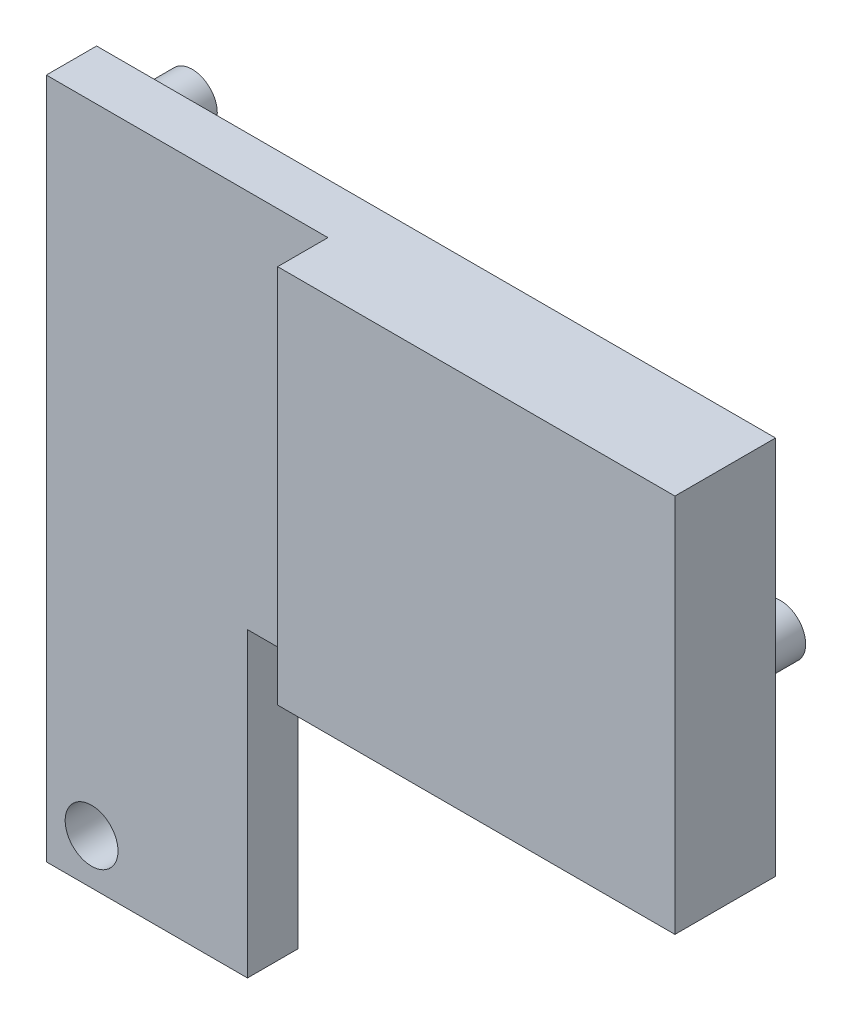
ISO-10303-21;
HEADER;
FILE_DESCRIPTION(('STEP AP214'),'2;1');
FILE_NAME('part.step','',(''),(''),'','','');
FILE_SCHEMA(('AUTOMOTIVE_DESIGN { 1 0 10303 214 1 1 1 1 }'));
ENDSEC;
DATA;
#1=APPLICATION_CONTEXT('core data for automotive mechanical design processes');
#2=APPLICATION_PROTOCOL_DEFINITION('international standard','automotive_design',2000,#1);
#3=PRODUCT_CONTEXT('',#1,'mechanical');
#4=PRODUCT('Part','Part','',(#3));
#5=PRODUCT_RELATED_PRODUCT_CATEGORY('part','',(#4));
#6=PRODUCT_DEFINITION_FORMATION('','',#4);
#7=PRODUCT_DEFINITION_CONTEXT('part definition',#1,'design');
#8=PRODUCT_DEFINITION('design','',#6,#7);
#9=PRODUCT_DEFINITION_SHAPE('','',#8);
#10=(LENGTH_UNIT() NAMED_UNIT(*) SI_UNIT(.MILLI.,.METRE.));
#11=(NAMED_UNIT(*) PLANE_ANGLE_UNIT() SI_UNIT($,.RADIAN.));
#12=(NAMED_UNIT(*) SI_UNIT($,.STERADIAN.) SOLID_ANGLE_UNIT());
#13=UNCERTAINTY_MEASURE_WITH_UNIT(LENGTH_MEASURE(1.E-05),#10,'distance_accuracy_value','');
#14=(GEOMETRIC_REPRESENTATION_CONTEXT(3) GLOBAL_UNCERTAINTY_ASSIGNED_CONTEXT((#13)) GLOBAL_UNIT_ASSIGNED_CONTEXT((#10,
#11,#12)) REPRESENTATION_CONTEXT('',''));
#15=CARTESIAN_POINT('',(0.,0.,0.));
#16=DIRECTION('',(0.,0.,1.));
#17=DIRECTION('',(1.,0.,0.));
#18=AXIS2_PLACEMENT_3D('',#15,#16,#17);
#19=CARTESIAN_POINT('',(0.,0.,2.));
#20=DIRECTION('',(0.,0.,-1.));
#21=DIRECTION('',(-1.,0.,0.));
#22=AXIS2_PLACEMENT_3D('',#19,#20,#21);
#23=PLANE('',#22);
#24=CARTESIAN_POINT('',(-51.85,-55.5,2.));
#25=DIRECTION('',(0.,0.,1.));
#26=DIRECTION('',(1.,0.,0.));
#27=AXIS2_PLACEMENT_3D('',#24,#25,#26);
#28=CIRCLE('',#27,1.05);
#29=CARTESIAN_POINT('',(-50.8,-55.5,2.));
#30=VERTEX_POINT('',#29);
#31=EDGE_CURVE('E157',#30,#30,#28,.T.);
#32=ORIENTED_EDGE('',*,*,#31,.F.);
#33=EDGE_LOOP('',(#32));
#34=FACE_BOUND('',#33,.T.);
#35=DIRECTION('',(0.,-1.,0.));
#36=VECTOR('',#35,1.);
#37=CARTESIAN_POINT('',(-42.45,-30.,2.));
#38=LINE('',#37,#36);
#39=CARTESIAN_POINT('',(-42.45,-30.2,2.));
#40=VERTEX_POINT('',#39);
#41=CARTESIAN_POINT('',(-42.45,-45.3,2.));
#42=VERTEX_POINT('',#41);
#43=EDGE_CURVE('E138',#40,#42,#38,.T.);
#44=ORIENTED_EDGE('',*,*,#43,.F.);
#45=DIRECTION('',(-1.,0.,0.));
#46=VECTOR('',#45,1.);
#47=CARTESIAN_POINT('',(0.,-30.2,2.));
#48=LINE('',#47,#46);
#49=CARTESIAN_POINT('',(-53.65,-30.2,2.));
#50=VERTEX_POINT('',#49);
#51=EDGE_CURVE('E141',#40,#50,#48,.T.);
#52=ORIENTED_EDGE('',*,*,#51,.T.);
#53=DIRECTION('',(0.,-1.,0.));
#54=VECTOR('',#53,1.);
#55=CARTESIAN_POINT('',(-53.65,-57.3,2.));
#56=LINE('',#55,#54);
#57=CARTESIAN_POINT('',(-53.65,-57.3,2.));
#58=VERTEX_POINT('',#57);
#59=EDGE_CURVE('E92',#50,#58,#56,.T.);
#60=ORIENTED_EDGE('',*,*,#59,.T.);
#61=DIRECTION('',(1.,0.,0.));
#62=VECTOR('',#61,1.);
#63=CARTESIAN_POINT('',(-53.65,-57.3,2.));
#64=LINE('',#63,#62);
#65=CARTESIAN_POINT('',(-45.65,-57.3,2.));
#66=VERTEX_POINT('',#65);
#67=EDGE_CURVE('E164',#58,#66,#64,.T.);
#68=ORIENTED_EDGE('',*,*,#67,.T.);
#69=DIRECTION('',(0.,1.,0.));
#70=VECTOR('',#69,1.);
#71=CARTESIAN_POINT('',(-45.65,-57.3,2.));
#72=LINE('',#71,#70);
#73=CARTESIAN_POINT('',(-45.65,-45.3,2.));
#74=VERTEX_POINT('',#73);
#75=EDGE_CURVE('E66',#66,#74,#72,.T.);
#76=ORIENTED_EDGE('',*,*,#75,.T.);
#77=DIRECTION('',(1.,0.,0.));
#78=VECTOR('',#77,1.);
#79=CARTESIAN_POINT('',(-45.65,-45.3,2.));
#80=LINE('',#79,#78);
#81=EDGE_CURVE('E167',#74,#42,#80,.T.);
#82=ORIENTED_EDGE('',*,*,#81,.T.);
#83=EDGE_LOOP('',(#44,#52,#60,#68,#76,#82));
#84=FACE_BOUND('',#83,.T.);
#85=ADVANCED_FACE('F42',(#34,#84),#23,.F.);
#86=CARTESIAN_POINT('',(0.,0.,0.));
#87=DIRECTION('',(0.,0.,-1.));
#88=DIRECTION('',(-1.,0.,0.));
#89=AXIS2_PLACEMENT_3D('',#86,#87,#88);
#90=PLANE('',#89);
#91=DIRECTION('',(-1.,0.,0.));
#92=VECTOR('',#91,1.);
#93=CARTESIAN_POINT('',(-26.65,-30.2,0.));
#94=LINE('',#93,#92);
#95=CARTESIAN_POINT('',(-26.65,-30.2,0.));
#96=VERTEX_POINT('',#95);
#97=CARTESIAN_POINT('',(-53.65,-30.2,0.));
#98=VERTEX_POINT('',#97);
#99=EDGE_CURVE('E122',#96,#98,#94,.T.);
#100=ORIENTED_EDGE('',*,*,#99,.F.);
#101=DIRECTION('',(0.,1.,0.));
#102=VECTOR('',#101,1.);
#103=CARTESIAN_POINT('',(-26.65,-45.3,0.));
#104=LINE('',#103,#102);
#105=CARTESIAN_POINT('',(-26.65,-45.3,0.));
#106=VERTEX_POINT('',#105);
#107=EDGE_CURVE('E130',#106,#96,#104,.T.);
#108=ORIENTED_EDGE('',*,*,#107,.F.);
#109=DIRECTION('',(1.,0.,0.));
#110=VECTOR('',#109,1.);
#111=CARTESIAN_POINT('',(-45.65,-45.3,0.));
#112=LINE('',#111,#110);
#113=CARTESIAN_POINT('',(-45.65,-45.3,0.));
#114=VERTEX_POINT('',#113);
#115=EDGE_CURVE('E87',#114,#106,#112,.T.);
#116=ORIENTED_EDGE('',*,*,#115,.F.);
#117=DIRECTION('',(0.,1.,0.));
#118=VECTOR('',#117,1.);
#119=CARTESIAN_POINT('',(-45.65,-57.3,0.));
#120=LINE('',#119,#118);
#121=CARTESIAN_POINT('',(-45.65,-57.3,0.));
#122=VERTEX_POINT('',#121);
#123=EDGE_CURVE('E173',#122,#114,#120,.T.);
#124=ORIENTED_EDGE('',*,*,#123,.F.);
#125=DIRECTION('',(1.,0.,0.));
#126=VECTOR('',#125,1.);
#127=CARTESIAN_POINT('',(-53.65,-57.3,0.));
#128=LINE('',#127,#126);
#129=CARTESIAN_POINT('',(-53.65,-57.3,0.));
#130=VERTEX_POINT('',#129);
#131=EDGE_CURVE('E171',#130,#122,#128,.T.);
#132=ORIENTED_EDGE('',*,*,#131,.F.);
#133=DIRECTION('',(0.,-1.,0.));
#134=VECTOR('',#133,1.);
#135=CARTESIAN_POINT('',(-53.65,-57.3,0.));
#136=LINE('',#135,#134);
#137=EDGE_CURVE('E160',#98,#130,#136,.T.);
#138=ORIENTED_EDGE('',*,*,#137,.F.);
#139=EDGE_LOOP('',(#100,#108,#116,#124,#132,#138));
#140=FACE_BOUND('',#139,.T.);
#141=CARTESIAN_POINT('',(-51.85,-32.1,0.));
#142=DIRECTION('',(0.,0.,-1.));
#143=DIRECTION('',(-1.,0.,0.));
#144=AXIS2_PLACEMENT_3D('',#141,#142,#143);
#145=CIRCLE('',#144,0.999999999999998);
#146=CARTESIAN_POINT('',(-52.85,-32.1,0.));
#147=VERTEX_POINT('',#146);
#148=EDGE_CURVE('E11',#147,#147,#145,.T.);
#149=ORIENTED_EDGE('',*,*,#148,.F.);
#150=EDGE_LOOP('',(#149));
#151=FACE_BOUND('',#150,.T.);
#152=CARTESIAN_POINT('',(-28.45,-38.7,0.));
#153=DIRECTION('',(0.,0.,-1.));
#154=DIRECTION('',(-1.,0.,0.));
#155=AXIS2_PLACEMENT_3D('',#152,#153,#154);
#156=CIRCLE('',#155,1.);
#157=CARTESIAN_POINT('',(-29.45,-38.7,0.));
#158=VERTEX_POINT('',#157);
#159=EDGE_CURVE('E50',#158,#158,#156,.T.);
#160=ORIENTED_EDGE('',*,*,#159,.F.);
#161=EDGE_LOOP('',(#160));
#162=FACE_BOUND('',#161,.T.);
#163=CARTESIAN_POINT('',(-51.85,-55.5,0.));
#164=DIRECTION('',(0.,0.,1.));
#165=DIRECTION('',(1.,0.,0.));
#166=AXIS2_PLACEMENT_3D('',#163,#164,#165);
#167=CIRCLE('',#166,1.05);
#168=CARTESIAN_POINT('',(-50.8,-55.5,0.));
#169=VERTEX_POINT('',#168);
#170=EDGE_CURVE('E156',#169,#169,#167,.T.);
#171=ORIENTED_EDGE('',*,*,#170,.T.);
#172=EDGE_LOOP('',(#171));
#173=FACE_BOUND('',#172,.T.);
#174=ADVANCED_FACE('F191',(#140,#151,#162,#173),#90,.T.);
#175=CARTESIAN_POINT('',(-53.65,-57.3,2.));
#176=DIRECTION('',(1.,0.,0.));
#177=DIRECTION('',(0.,1.,0.));
#178=AXIS2_PLACEMENT_3D('',#175,#176,#177);
#179=PLANE('',#178);
#180=ORIENTED_EDGE('',*,*,#59,.F.);
#181=DIRECTION('',(0.,0.,-1.));
#182=VECTOR('',#181,1.);
#183=CARTESIAN_POINT('',(-53.65,-30.2,4.));
#184=LINE('',#183,#182);
#185=EDGE_CURVE('E131',#50,#98,#184,.T.);
#186=ORIENTED_EDGE('',*,*,#185,.T.);
#187=ORIENTED_EDGE('',*,*,#137,.T.);
#188=DIRECTION('',(0.,0.,-1.));
#189=VECTOR('',#188,1.);
#190=CARTESIAN_POINT('',(-53.65,-57.3,2.));
#191=LINE('',#190,#189);
#192=EDGE_CURVE('E183',#58,#130,#191,.T.);
#193=ORIENTED_EDGE('',*,*,#192,.F.);
#194=EDGE_LOOP('',(#180,#186,#187,#193));
#195=FACE_BOUND('',#194,.T.);
#196=ADVANCED_FACE('F44',(#195),#179,.F.);
#197=CARTESIAN_POINT('',(-53.65,-57.3,2.));
#198=DIRECTION('',(0.,1.,0.));
#199=DIRECTION('',(0.,0.,1.));
#200=AXIS2_PLACEMENT_3D('',#197,#198,#199);
#201=PLANE('',#200);
#202=ORIENTED_EDGE('',*,*,#131,.T.);
#203=DIRECTION('',(0.,0.,-1.));
#204=VECTOR('',#203,1.);
#205=CARTESIAN_POINT('',(-45.65,-57.3,2.));
#206=LINE('',#205,#204);
#207=EDGE_CURVE('E180',#66,#122,#206,.T.);
#208=ORIENTED_EDGE('',*,*,#207,.F.);
#209=ORIENTED_EDGE('',*,*,#67,.F.);
#210=ORIENTED_EDGE('',*,*,#192,.T.);
#211=EDGE_LOOP('',(#202,#208,#209,#210));
#212=FACE_BOUND('',#211,.T.);
#213=ADVANCED_FACE('F221',(#212),#201,.F.);
#214=CARTESIAN_POINT('',(-45.65,-57.3,2.));
#215=DIRECTION('',(-1.,0.,0.));
#216=DIRECTION('',(0.,0.,1.));
#217=AXIS2_PLACEMENT_3D('',#214,#215,#216);
#218=PLANE('',#217);
#219=ORIENTED_EDGE('',*,*,#123,.T.);
#220=DIRECTION('',(0.,0.,-1.));
#221=VECTOR('',#220,1.);
#222=CARTESIAN_POINT('',(-45.65,-45.3,2.));
#223=LINE('',#222,#221);
#224=EDGE_CURVE('E178',#74,#114,#223,.T.);
#225=ORIENTED_EDGE('',*,*,#224,.F.);
#226=ORIENTED_EDGE('',*,*,#75,.F.);
#227=ORIENTED_EDGE('',*,*,#207,.T.);
#228=EDGE_LOOP('',(#219,#225,#226,#227));
#229=FACE_BOUND('',#228,.T.);
#230=ADVANCED_FACE('F219',(#229),#218,.F.);
#231=CARTESIAN_POINT('',(-45.65,-45.3,2.));
#232=DIRECTION('',(0.,1.,0.));
#233=DIRECTION('',(0.,0.,1.));
#234=AXIS2_PLACEMENT_3D('',#231,#232,#233);
#235=PLANE('',#234);
#236=ORIENTED_EDGE('',*,*,#115,.T.);
#237=DIRECTION('',(0.,0.,-1.));
#238=VECTOR('',#237,1.);
#239=CARTESIAN_POINT('',(-26.65,-45.3,2.));
#240=LINE('',#239,#238);
#241=CARTESIAN_POINT('',(-26.65,-45.3,4.));
#242=VERTEX_POINT('',#241);
#243=EDGE_CURVE('E169',#242,#106,#240,.T.);
#244=ORIENTED_EDGE('',*,*,#243,.F.);
#245=DIRECTION('',(1.,0.,0.));
#246=VECTOR('',#245,1.);
#247=CARTESIAN_POINT('',(-26.65,-45.3,4.));
#248=LINE('',#247,#246);
#249=CARTESIAN_POINT('',(-42.45,-45.3,4.));
#250=VERTEX_POINT('',#249);
#251=EDGE_CURVE('E136',#250,#242,#248,.T.);
#252=ORIENTED_EDGE('',*,*,#251,.F.);
#253=DIRECTION('',(0.,0.,-1.));
#254=VECTOR('',#253,1.);
#255=CARTESIAN_POINT('',(-42.45,-45.3,4.));
#256=LINE('',#255,#254);
#257=EDGE_CURVE('E146',#250,#42,#256,.T.);
#258=ORIENTED_EDGE('',*,*,#257,.T.);
#259=ORIENTED_EDGE('',*,*,#81,.F.);
#260=ORIENTED_EDGE('',*,*,#224,.T.);
#261=EDGE_LOOP('',(#236,#244,#252,#258,#259,#260));
#262=FACE_BOUND('',#261,.T.);
#263=ADVANCED_FACE('F208',(#262),#235,.F.);
#264=CARTESIAN_POINT('',(-26.65,-45.3,2.));
#265=DIRECTION('',(-1.,0.,0.));
#266=DIRECTION('',(0.,0.,1.));
#267=AXIS2_PLACEMENT_3D('',#264,#265,#266);
#268=PLANE('',#267);
#269=ORIENTED_EDGE('',*,*,#107,.T.);
#270=DIRECTION('',(0.,0.,-1.));
#271=VECTOR('',#270,1.);
#272=CARTESIAN_POINT('',(-26.65,-30.2,4.));
#273=LINE('',#272,#271);
#274=CARTESIAN_POINT('',(-26.65,-30.2,4.));
#275=VERTEX_POINT('',#274);
#276=EDGE_CURVE('E117',#275,#96,#273,.T.);
#277=ORIENTED_EDGE('',*,*,#276,.F.);
#278=DIRECTION('',(0.,1.,0.));
#279=VECTOR('',#278,1.);
#280=CARTESIAN_POINT('',(-26.65,-30.,4.));
#281=LINE('',#280,#279);
#282=EDGE_CURVE('E128',#242,#275,#281,.T.);
#283=ORIENTED_EDGE('',*,*,#282,.F.);
#284=ORIENTED_EDGE('',*,*,#243,.T.);
#285=EDGE_LOOP('',(#269,#277,#283,#284));
#286=FACE_BOUND('',#285,.T.);
#287=ADVANCED_FACE('F127',(#286),#268,.F.);
#288=CARTESIAN_POINT('',(-51.85,-55.5,2.));
#289=DIRECTION('',(0.,0.,-1.));
#290=DIRECTION('',(-1.,0.,0.));
#291=AXIS2_PLACEMENT_3D('',#288,#289,#290);
#292=CYLINDRICAL_SURFACE('',#291,1.05);
#293=ORIENTED_EDGE('',*,*,#31,.T.);
#294=EDGE_LOOP('',(#293));
#295=FACE_BOUND('',#294,.T.);
#296=ORIENTED_EDGE('',*,*,#170,.F.);
#297=EDGE_LOOP('',(#296));
#298=FACE_BOUND('',#297,.T.);
#299=ADVANCED_FACE('F198',(#295,#298),#292,.F.);
#300=CARTESIAN_POINT('',(-28.45,-38.7,-2.));
#301=DIRECTION('',(0.,0.,1.));
#302=DIRECTION('',(1.,0.,0.));
#303=AXIS2_PLACEMENT_3D('',#300,#301,#302);
#304=CYLINDRICAL_SURFACE('',#303,1.);
#305=ORIENTED_EDGE('',*,*,#159,.T.);
#306=EDGE_LOOP('',(#305));
#307=FACE_BOUND('',#306,.T.);
#308=CARTESIAN_POINT('',(-28.45,-38.7,-2.));
#309=DIRECTION('',(0.,0.,1.));
#310=DIRECTION('',(1.,0.,0.));
#311=AXIS2_PLACEMENT_3D('',#308,#309,#310);
#312=CIRCLE('',#311,1.);
#313=CARTESIAN_POINT('',(-27.45,-38.7,-2.));
#314=VERTEX_POINT('',#313);
#315=EDGE_CURVE('E153',#314,#314,#312,.T.);
#316=ORIENTED_EDGE('',*,*,#315,.T.);
#317=EDGE_LOOP('',(#316));
#318=FACE_BOUND('',#317,.T.);
#319=ADVANCED_FACE('F188',(#307,#318),#304,.T.);
#320=CARTESIAN_POINT('',(-28.45,-38.7,-2.));
#321=DIRECTION('',(0.,0.,1.));
#322=DIRECTION('',(1.,0.,0.));
#323=AXIS2_PLACEMENT_3D('',#320,#321,#322);
#324=PLANE('',#323);
#325=ORIENTED_EDGE('',*,*,#315,.F.);
#326=EDGE_LOOP('',(#325));
#327=FACE_BOUND('',#326,.T.);
#328=ADVANCED_FACE('F206',(#327),#324,.F.);
#329=CARTESIAN_POINT('',(-51.85,-32.1,-2.));
#330=DIRECTION('',(0.,0.,1.));
#331=DIRECTION('',(1.,0.,0.));
#332=AXIS2_PLACEMENT_3D('',#329,#330,#331);
#333=CYLINDRICAL_SURFACE('',#332,0.999999999999998);
#334=ORIENTED_EDGE('',*,*,#148,.T.);
#335=EDGE_LOOP('',(#334));
#336=FACE_BOUND('',#335,.T.);
#337=CARTESIAN_POINT('',(-51.85,-32.1,-2.));
#338=DIRECTION('',(0.,0.,1.));
#339=DIRECTION('',(1.,0.,0.));
#340=AXIS2_PLACEMENT_3D('',#337,#338,#339);
#341=CIRCLE('',#340,0.999999999999998);
#342=CARTESIAN_POINT('',(-50.85,-32.1,-2.));
#343=VERTEX_POINT('',#342);
#344=EDGE_CURVE('E150',#343,#343,#341,.T.);
#345=ORIENTED_EDGE('',*,*,#344,.T.);
#346=EDGE_LOOP('',(#345));
#347=FACE_BOUND('',#346,.T.);
#348=ADVANCED_FACE('F251',(#336,#347),#333,.T.);
#349=CARTESIAN_POINT('',(-51.85,-32.1,-2.));
#350=DIRECTION('',(0.,0.,1.));
#351=DIRECTION('',(1.,0.,0.));
#352=AXIS2_PLACEMENT_3D('',#349,#350,#351);
#353=PLANE('',#352);
#354=ORIENTED_EDGE('',*,*,#344,.F.);
#355=EDGE_LOOP('',(#354));
#356=FACE_BOUND('',#355,.T.);
#357=ADVANCED_FACE('F244',(#356),#353,.F.);
#358=CARTESIAN_POINT('',(-42.45,-30.,4.));
#359=DIRECTION('',(1.,0.,0.));
#360=DIRECTION('',(0.,0.,-1.));
#361=AXIS2_PLACEMENT_3D('',#358,#359,#360);
#362=PLANE('',#361);
#363=DIRECTION('',(0.,-1.,0.));
#364=VECTOR('',#363,1.);
#365=CARTESIAN_POINT('',(-42.45,-30.,4.));
#366=LINE('',#365,#364);
#367=CARTESIAN_POINT('',(-42.45,-30.2,4.));
#368=VERTEX_POINT('',#367);
#369=EDGE_CURVE('E137',#368,#250,#366,.T.);
#370=ORIENTED_EDGE('',*,*,#369,.F.);
#371=DIRECTION('',(0.,0.,-1.));
#372=VECTOR('',#371,1.);
#373=CARTESIAN_POINT('',(-42.45,-30.2,4.));
#374=LINE('',#373,#372);
#375=EDGE_CURVE('E57',#368,#40,#374,.T.);
#376=ORIENTED_EDGE('',*,*,#375,.T.);
#377=ORIENTED_EDGE('',*,*,#43,.T.);
#378=ORIENTED_EDGE('',*,*,#257,.F.);
#379=EDGE_LOOP('',(#370,#376,#377,#378));
#380=FACE_BOUND('',#379,.T.);
#381=ADVANCED_FACE('F242',(#380),#362,.F.);
#382=CARTESIAN_POINT('',(0.,0.,4.));
#383=DIRECTION('',(0.,0.,-1.));
#384=DIRECTION('',(-1.,0.,0.));
#385=AXIS2_PLACEMENT_3D('',#382,#383,#384);
#386=PLANE('',#385);
#387=ORIENTED_EDGE('',*,*,#282,.T.);
#388=DIRECTION('',(-1.,0.,0.));
#389=VECTOR('',#388,1.);
#390=CARTESIAN_POINT('',(-26.65,-30.2,4.));
#391=LINE('',#390,#389);
#392=EDGE_CURVE('E114',#275,#368,#391,.T.);
#393=ORIENTED_EDGE('',*,*,#392,.T.);
#394=ORIENTED_EDGE('',*,*,#369,.T.);
#395=ORIENTED_EDGE('',*,*,#251,.T.);
#396=EDGE_LOOP('',(#387,#393,#394,#395));
#397=FACE_BOUND('',#396,.T.);
#398=ADVANCED_FACE('F134',(#397),#386,.F.);
#399=CARTESIAN_POINT('',(-26.65,-30.2,4.));
#400=DIRECTION('',(0.,-1.,0.));
#401=DIRECTION('',(0.,0.,-1.));
#402=AXIS2_PLACEMENT_3D('',#399,#400,#401);
#403=PLANE('',#402);
#404=ORIENTED_EDGE('',*,*,#375,.F.);
#405=ORIENTED_EDGE('',*,*,#392,.F.);
#406=ORIENTED_EDGE('',*,*,#276,.T.);
#407=ORIENTED_EDGE('',*,*,#99,.T.);
#408=ORIENTED_EDGE('',*,*,#185,.F.);
#409=ORIENTED_EDGE('',*,*,#51,.F.);
#410=EDGE_LOOP('',(#404,#405,#406,#407,#408,#409));
#411=FACE_BOUND('',#410,.T.);
#412=ADVANCED_FACE('F116',(#411),#403,.F.);
#413=CLOSED_SHELL('',(#85,#174,#196,#213,#230,#263,#287,#299,#319,#328,#348,#357,#381,#398,#412));
#414=MANIFOLD_SOLID_BREP('B2',#413);
#415=ADVANCED_BREP_SHAPE_REPRESENTATION('',(#18,#414),#14);
#416=SHAPE_DEFINITION_REPRESENTATION(#9,#415);
ENDSEC;
END-ISO-10303-21;
